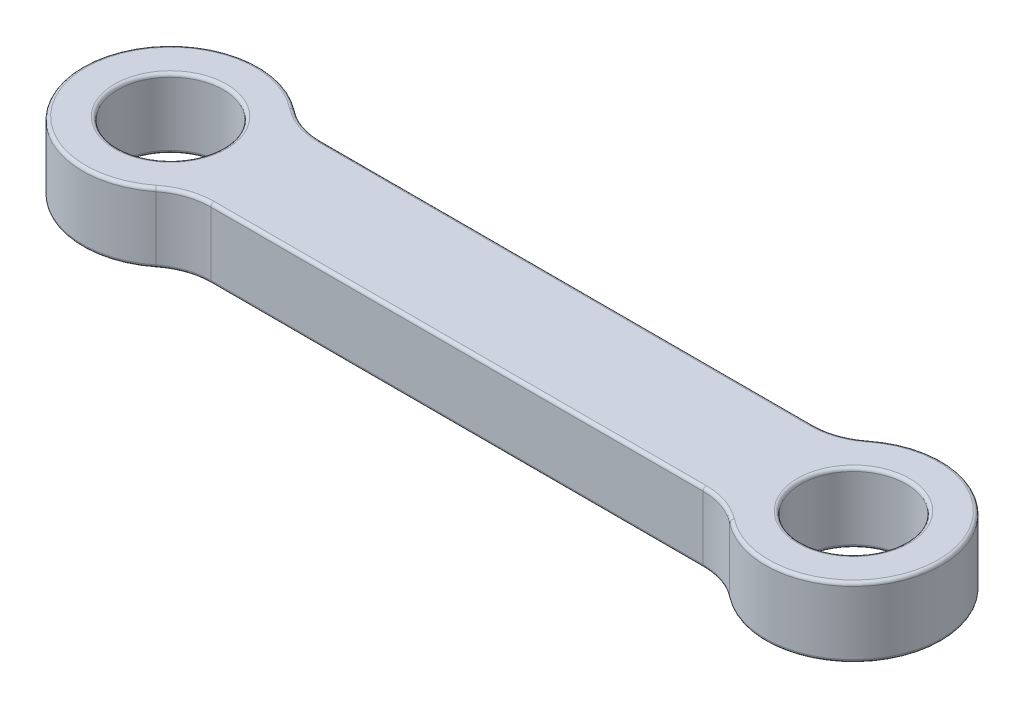
ISO-10303-21;
HEADER;
FILE_DESCRIPTION(('STEP AP214'),'2;1');
FILE_NAME('part.step','',(''),(''),'','','');
FILE_SCHEMA(('AUTOMOTIVE_DESIGN { 1 0 10303 214 1 1 1 1 }'));
ENDSEC;
DATA;
#1=APPLICATION_CONTEXT('core data for automotive mechanical design processes');
#2=APPLICATION_PROTOCOL_DEFINITION('international standard','automotive_design',2000,#1);
#3=PRODUCT_CONTEXT('',#1,'mechanical');
#4=PRODUCT('Part','Part','',(#3));
#5=PRODUCT_RELATED_PRODUCT_CATEGORY('part','',(#4));
#6=PRODUCT_DEFINITION_FORMATION('','',#4);
#7=PRODUCT_DEFINITION_CONTEXT('part definition',#1,'design');
#8=PRODUCT_DEFINITION('design','',#6,#7);
#9=PRODUCT_DEFINITION_SHAPE('','',#8);
#10=(LENGTH_UNIT() NAMED_UNIT(*) SI_UNIT(.MILLI.,.METRE.));
#11=(NAMED_UNIT(*) PLANE_ANGLE_UNIT() SI_UNIT($,.RADIAN.));
#12=(NAMED_UNIT(*) SI_UNIT($,.STERADIAN.) SOLID_ANGLE_UNIT());
#13=UNCERTAINTY_MEASURE_WITH_UNIT(LENGTH_MEASURE(1.E-05),#10,'distance_accuracy_value','');
#14=(GEOMETRIC_REPRESENTATION_CONTEXT(3) GLOBAL_UNCERTAINTY_ASSIGNED_CONTEXT((#13)) GLOBAL_UNIT_ASSIGNED_CONTEXT((#10,
#11,#12)) REPRESENTATION_CONTEXT('',''));
#15=CARTESIAN_POINT('',(0.,0.,0.));
#16=DIRECTION('',(0.,0.,1.));
#17=DIRECTION('',(1.,0.,0.));
#18=AXIS2_PLACEMENT_3D('',#15,#16,#17);
#19=CARTESIAN_POINT('',(-15.5,3.175,0.));
#20=DIRECTION('',(0.,-1.,0.));
#21=DIRECTION('',(0.,0.,-1.));
#22=AXIS2_PLACEMENT_3D('',#19,#20,#21);
#23=CYLINDRICAL_SURFACE('',#22,4.);
#24=DIRECTION('',(0.,-1.,0.));
#25=VECTOR('',#24,1.);
#26=CARTESIAN_POINT('',(-13.025641703473,3.175,-3.14285714285715));
#27=LINE('',#26,#25);
#28=CARTESIAN_POINT('',(-13.025641703473,3.025,-3.14285714285715));
#29=VERTEX_POINT('',#28);
#30=CARTESIAN_POINT('',(-13.025641703473,0.15,-3.14285714285715));
#31=VERTEX_POINT('',#30);
#32=EDGE_CURVE('E368',#29,#31,#27,.T.);
#33=ORIENTED_EDGE('',*,*,#32,.T.);
#34=CARTESIAN_POINT('',(-15.5,0.15,0.));
#35=DIRECTION('',(0.,1.,0.));
#36=DIRECTION('',(0.,0.,1.));
#37=AXIS2_PLACEMENT_3D('',#34,#35,#36);
#38=CIRCLE('',#37,4.);
#39=CARTESIAN_POINT('',(-13.025641703473,0.15,3.14285714285714));
#40=VERTEX_POINT('',#39);
#41=EDGE_CURVE('E256',#31,#40,#38,.T.);
#42=ORIENTED_EDGE('',*,*,#41,.T.);
#43=DIRECTION('',(0.,-1.,0.));
#44=VECTOR('',#43,1.);
#45=CARTESIAN_POINT('',(-13.025641703473,3.175,3.14285714285714));
#46=LINE('',#45,#44);
#47=CARTESIAN_POINT('',(-13.025641703473,3.025,3.14285714285714));
#48=VERTEX_POINT('',#47);
#49=EDGE_CURVE('E316',#40,#48,#46,.F.);
#50=ORIENTED_EDGE('',*,*,#49,.T.);
#51=CARTESIAN_POINT('',(-15.5,3.025,0.));
#52=DIRECTION('',(0.,1.,0.));
#53=DIRECTION('',(0.,0.,1.));
#54=AXIS2_PLACEMENT_3D('',#51,#52,#53);
#55=CIRCLE('',#54,4.);
#56=EDGE_CURVE('E253',#48,#29,#55,.F.);
#57=ORIENTED_EDGE('',*,*,#56,.T.);
#58=EDGE_LOOP('',(#33,#42,#50,#57));
#59=FACE_BOUND('',#58,.T.);
#60=ADVANCED_FACE('F47',(#59),#23,.T.);
#61=CARTESIAN_POINT('',(0.,3.175,2.5));
#62=DIRECTION('',(0.,0.,-1.));
#63=DIRECTION('',(-1.,0.,0.));
#64=AXIS2_PLACEMENT_3D('',#61,#62,#63);
#65=PLANE('',#64);
#66=DIRECTION('',(0.,1.,0.));
#67=VECTOR('',#66,1.);
#68=CARTESIAN_POINT('',(-11.1698729810778,0.,2.5));
#69=LINE('',#68,#67);
#70=CARTESIAN_POINT('',(-11.1698729810778,3.025,2.5));
#71=VERTEX_POINT('',#70);
#72=CARTESIAN_POINT('',(-11.1698729810778,0.15,2.5));
#73=VERTEX_POINT('',#72);
#74=EDGE_CURVE('E363',#71,#73,#69,.F.);
#75=ORIENTED_EDGE('',*,*,#74,.T.);
#76=DIRECTION('',(1.,0.,0.));
#77=VECTOR('',#76,1.);
#78=CARTESIAN_POINT('',(0.,0.15,2.5));
#79=LINE('',#78,#77);
#80=CARTESIAN_POINT('',(11.1698729810778,0.15,2.5));
#81=VERTEX_POINT('',#80);
#82=EDGE_CURVE('E219',#73,#81,#79,.T.);
#83=ORIENTED_EDGE('',*,*,#82,.T.);
#84=DIRECTION('',(0.,1.,0.));
#85=VECTOR('',#84,1.);
#86=CARTESIAN_POINT('',(11.1698729810778,3.175,2.5));
#87=LINE('',#86,#85);
#88=CARTESIAN_POINT('',(11.1698729810778,3.025,2.5));
#89=VERTEX_POINT('',#88);
#90=EDGE_CURVE('E391',#81,#89,#87,.T.);
#91=ORIENTED_EDGE('',*,*,#90,.T.);
#92=DIRECTION('',(1.,0.,0.));
#93=VECTOR('',#92,1.);
#94=CARTESIAN_POINT('',(-11.1698729810778,3.025,2.5));
#95=LINE('',#94,#93);
#96=EDGE_CURVE('E216',#89,#71,#95,.F.);
#97=ORIENTED_EDGE('',*,*,#96,.T.);
#98=EDGE_LOOP('',(#75,#83,#91,#97));
#99=FACE_BOUND('',#98,.T.);
#100=ADVANCED_FACE('F421',(#99),#65,.F.);
#101=CARTESIAN_POINT('',(15.5,3.175,0.));
#102=DIRECTION('',(0.,-1.,0.));
#103=DIRECTION('',(0.,0.,-1.));
#104=AXIS2_PLACEMENT_3D('',#101,#102,#103);
#105=CYLINDRICAL_SURFACE('',#104,3.99999999999999);
#106=DIRECTION('',(0.,-1.,0.));
#107=VECTOR('',#106,1.);
#108=CARTESIAN_POINT('',(13.025641703473,3.175,3.14285714285714));
#109=LINE('',#108,#107);
#110=CARTESIAN_POINT('',(13.025641703473,3.025,3.14285714285714));
#111=VERTEX_POINT('',#110);
#112=CARTESIAN_POINT('',(13.025641703473,0.15,3.14285714285714));
#113=VERTEX_POINT('',#112);
#114=EDGE_CURVE('E381',#111,#113,#109,.T.);
#115=ORIENTED_EDGE('',*,*,#114,.T.);
#116=CARTESIAN_POINT('',(15.5,0.15,0.));
#117=DIRECTION('',(0.,1.,0.));
#118=DIRECTION('',(0.,0.,1.));
#119=AXIS2_PLACEMENT_3D('',#116,#117,#118);
#120=CIRCLE('',#119,3.99999999999999);
#121=CARTESIAN_POINT('',(13.025641703473,0.15,-3.14285714285714));
#122=VERTEX_POINT('',#121);
#123=EDGE_CURVE('E231',#113,#122,#120,.T.);
#124=ORIENTED_EDGE('',*,*,#123,.T.);
#125=DIRECTION('',(0.,-1.,0.));
#126=VECTOR('',#125,1.);
#127=CARTESIAN_POINT('',(13.025641703473,3.175,-3.14285714285714));
#128=LINE('',#127,#126);
#129=CARTESIAN_POINT('',(13.025641703473,3.025,-3.14285714285714));
#130=VERTEX_POINT('',#129);
#131=EDGE_CURVE('E385',#122,#130,#128,.F.);
#132=ORIENTED_EDGE('',*,*,#131,.T.);
#133=CARTESIAN_POINT('',(15.5,3.025,0.));
#134=DIRECTION('',(0.,1.,0.));
#135=DIRECTION('',(0.,0.,1.));
#136=AXIS2_PLACEMENT_3D('',#133,#134,#135);
#137=CIRCLE('',#136,3.99999999999999);
#138=EDGE_CURVE('E228',#130,#111,#137,.F.);
#139=ORIENTED_EDGE('',*,*,#138,.T.);
#140=EDGE_LOOP('',(#115,#124,#132,#139));
#141=FACE_BOUND('',#140,.T.);
#142=ADVANCED_FACE('F466',(#141),#105,.T.);
#143=CARTESIAN_POINT('',(0.,3.175,-2.5));
#144=DIRECTION('',(0.,0.,-1.));
#145=DIRECTION('',(-1.,0.,0.));
#146=AXIS2_PLACEMENT_3D('',#143,#144,#145);
#147=PLANE('',#146);
#148=DIRECTION('',(0.,-1.,0.));
#149=VECTOR('',#148,1.);
#150=CARTESIAN_POINT('',(11.1698729810778,3.175,-2.5));
#151=LINE('',#150,#149);
#152=CARTESIAN_POINT('',(11.1698729810778,3.025,-2.5));
#153=VERTEX_POINT('',#152);
#154=CARTESIAN_POINT('',(11.1698729810778,0.15,-2.5));
#155=VERTEX_POINT('',#154);
#156=EDGE_CURVE('E371',#153,#155,#151,.T.);
#157=ORIENTED_EDGE('',*,*,#156,.T.);
#158=DIRECTION('',(1.,0.,0.));
#159=VECTOR('',#158,1.);
#160=CARTESIAN_POINT('',(-11.1698729810778,0.15,-2.5));
#161=LINE('',#160,#159);
#162=CARTESIAN_POINT('',(-11.1698729810778,0.15,-2.5));
#163=VERTEX_POINT('',#162);
#164=EDGE_CURVE('E244',#155,#163,#161,.F.);
#165=ORIENTED_EDGE('',*,*,#164,.T.);
#166=DIRECTION('',(0.,-1.,0.));
#167=VECTOR('',#166,1.);
#168=CARTESIAN_POINT('',(-11.1698729810778,3.175,-2.5));
#169=LINE('',#168,#167);
#170=CARTESIAN_POINT('',(-11.1698729810778,3.025,-2.5));
#171=VERTEX_POINT('',#170);
#172=EDGE_CURVE('E377',#163,#171,#169,.F.);
#173=ORIENTED_EDGE('',*,*,#172,.T.);
#174=DIRECTION('',(1.,0.,0.));
#175=VECTOR('',#174,1.);
#176=CARTESIAN_POINT('',(0.,3.025,-2.5));
#177=LINE('',#176,#175);
#178=EDGE_CURVE('E241',#171,#153,#177,.T.);
#179=ORIENTED_EDGE('',*,*,#178,.T.);
#180=EDGE_LOOP('',(#157,#165,#173,#179));
#181=FACE_BOUND('',#180,.T.);
#182=ADVANCED_FACE('F450',(#181),#147,.T.);
#183=CARTESIAN_POINT('',(-15.5,3.175,0.));
#184=DIRECTION('',(0.,-1.,0.));
#185=DIRECTION('',(0.,0.,-1.));
#186=AXIS2_PLACEMENT_3D('',#183,#184,#185);
#187=CYLINDRICAL_SURFACE('',#186,2.395);
#188=CARTESIAN_POINT('',(-15.5,0.15,0.));
#189=DIRECTION('',(0.,1.,0.));
#190=DIRECTION('',(0.,0.,1.));
#191=AXIS2_PLACEMENT_3D('',#188,#189,#190);
#192=CIRCLE('',#191,2.395);
#193=CARTESIAN_POINT('',(-15.5,0.15,2.395));
#194=VERTEX_POINT('',#193);
#195=EDGE_CURVE('E263',#194,#194,#192,.F.);
#196=ORIENTED_EDGE('',*,*,#195,.T.);
#197=EDGE_LOOP('',(#196));
#198=FACE_BOUND('',#197,.T.);
#199=CARTESIAN_POINT('',(-15.5,3.025,0.));
#200=DIRECTION('',(0.,1.,0.));
#201=DIRECTION('',(0.,0.,1.));
#202=AXIS2_PLACEMENT_3D('',#199,#200,#201);
#203=CIRCLE('',#202,2.395);
#204=CARTESIAN_POINT('',(-15.5,3.025,2.395));
#205=VERTEX_POINT('',#204);
#206=EDGE_CURVE('E259',#205,#205,#203,.T.);
#207=ORIENTED_EDGE('',*,*,#206,.T.);
#208=EDGE_LOOP('',(#207));
#209=FACE_BOUND('',#208,.T.);
#210=ADVANCED_FACE('F473',(#198,#209),#187,.F.);
#211=CARTESIAN_POINT('',(15.5,3.175,0.));
#212=DIRECTION('',(0.,-1.,0.));
#213=DIRECTION('',(0.,0.,-1.));
#214=AXIS2_PLACEMENT_3D('',#211,#212,#213);
#215=CYLINDRICAL_SURFACE('',#214,2.395);
#216=CARTESIAN_POINT('',(15.5,0.15,0.));
#217=DIRECTION('',(0.,1.,0.));
#218=DIRECTION('',(0.,0.,1.));
#219=AXIS2_PLACEMENT_3D('',#216,#217,#218);
#220=CIRCLE('',#219,2.395);
#221=CARTESIAN_POINT('',(15.5,0.15,2.39500000000001));
#222=VERTEX_POINT('',#221);
#223=EDGE_CURVE('E207',#222,#222,#220,.F.);
#224=ORIENTED_EDGE('',*,*,#223,.T.);
#225=EDGE_LOOP('',(#224));
#226=FACE_BOUND('',#225,.T.);
#227=CARTESIAN_POINT('',(15.5,3.025,0.));
#228=DIRECTION('',(0.,1.,0.));
#229=DIRECTION('',(0.,0.,1.));
#230=AXIS2_PLACEMENT_3D('',#227,#228,#229);
#231=CIRCLE('',#230,2.395);
#232=CARTESIAN_POINT('',(15.5,3.025,2.39500000000001));
#233=VERTEX_POINT('',#232);
#234=EDGE_CURVE('E198',#233,#233,#231,.T.);
#235=ORIENTED_EDGE('',*,*,#234,.T.);
#236=EDGE_LOOP('',(#235));
#237=FACE_BOUND('',#236,.T.);
#238=ADVANCED_FACE('F483',(#226,#237),#215,.F.);
#239=CARTESIAN_POINT('',(0.,3.175,0.));
#240=DIRECTION('',(0.,1.,0.));
#241=DIRECTION('',(0.,0.,1.));
#242=AXIS2_PLACEMENT_3D('',#239,#240,#241);
#243=PLANE('',#242);
#244=CARTESIAN_POINT('',(15.5,3.175,0.));
#245=DIRECTION('',(0.,1.,0.));
#246=DIRECTION('',(0.,0.,1.));
#247=AXIS2_PLACEMENT_3D('',#244,#245,#246);
#248=CIRCLE('',#247,2.545);
#249=CARTESIAN_POINT('',(15.5,3.175,2.54500000000001));
#250=VERTEX_POINT('',#249);
#251=EDGE_CURVE('E11',#250,#250,#248,.F.);
#252=ORIENTED_EDGE('',*,*,#251,.T.);
#253=EDGE_LOOP('',(#252));
#254=FACE_BOUND('',#253,.T.);
#255=CARTESIAN_POINT('',(15.5,3.175,0.));
#256=DIRECTION('',(0.,1.,0.));
#257=DIRECTION('',(0.,0.,1.));
#258=AXIS2_PLACEMENT_3D('',#255,#256,#257);
#259=CIRCLE('',#258,3.84999999999999);
#260=CARTESIAN_POINT('',(13.1184301395928,3.175,3.025));
#261=VERTEX_POINT('',#260);
#262=CARTESIAN_POINT('',(13.1184301395928,3.175,-3.025));
#263=VERTEX_POINT('',#262);
#264=EDGE_CURVE('E65',#261,#263,#259,.T.);
#265=ORIENTED_EDGE('',*,*,#264,.T.);
#266=CARTESIAN_POINT('',(11.1698729810778,3.175,-5.5));
#267=DIRECTION('',(0.,1.,0.));
#268=DIRECTION('',(0.,0.,1.));
#269=AXIS2_PLACEMENT_3D('',#266,#267,#268);
#270=CIRCLE('',#269,3.15);
#271=CARTESIAN_POINT('',(11.1698729810778,3.175,-2.35));
#272=VERTEX_POINT('',#271);
#273=EDGE_CURVE('E57',#263,#272,#270,.F.);
#274=ORIENTED_EDGE('',*,*,#273,.T.);
#275=DIRECTION('',(1.,0.,0.));
#276=VECTOR('',#275,1.);
#277=CARTESIAN_POINT('',(0.,3.175,-2.35));
#278=LINE('',#277,#276);
#279=CARTESIAN_POINT('',(-11.1698729810778,3.175,-2.35));
#280=VERTEX_POINT('',#279);
#281=EDGE_CURVE('E271',#272,#280,#278,.F.);
#282=ORIENTED_EDGE('',*,*,#281,.T.);
#283=CARTESIAN_POINT('',(-11.1698729810778,3.175,-5.5));
#284=DIRECTION('',(0.,1.,0.));
#285=DIRECTION('',(0.,0.,1.));
#286=AXIS2_PLACEMENT_3D('',#283,#284,#285);
#287=CIRCLE('',#286,3.15);
#288=CARTESIAN_POINT('',(-13.1184301395928,3.175,-3.025));
#289=VERTEX_POINT('',#288);
#290=EDGE_CURVE('E274',#280,#289,#287,.F.);
#291=ORIENTED_EDGE('',*,*,#290,.T.);
#292=CARTESIAN_POINT('',(-15.5,3.175,0.));
#293=DIRECTION('',(0.,1.,0.));
#294=DIRECTION('',(0.,0.,1.));
#295=AXIS2_PLACEMENT_3D('',#292,#293,#294);
#296=CIRCLE('',#295,3.85);
#297=CARTESIAN_POINT('',(-13.1184301395928,3.175,3.025));
#298=VERTEX_POINT('',#297);
#299=EDGE_CURVE('E277',#289,#298,#296,.T.);
#300=ORIENTED_EDGE('',*,*,#299,.T.);
#301=CARTESIAN_POINT('',(-11.1698729810778,3.175,5.5));
#302=DIRECTION('',(0.,1.,0.));
#303=DIRECTION('',(0.,0.,1.));
#304=AXIS2_PLACEMENT_3D('',#301,#302,#303);
#305=CIRCLE('',#304,3.15);
#306=CARTESIAN_POINT('',(-11.1698729810778,3.175,2.35));
#307=VERTEX_POINT('',#306);
#308=EDGE_CURVE('E280',#298,#307,#305,.F.);
#309=ORIENTED_EDGE('',*,*,#308,.T.);
#310=DIRECTION('',(1.,0.,0.));
#311=VECTOR('',#310,1.);
#312=CARTESIAN_POINT('',(11.1698729810778,3.175,2.35));
#313=LINE('',#312,#311);
#314=CARTESIAN_POINT('',(11.1698729810778,3.175,2.35));
#315=VERTEX_POINT('',#314);
#316=EDGE_CURVE('E283',#307,#315,#313,.T.);
#317=ORIENTED_EDGE('',*,*,#316,.T.);
#318=CARTESIAN_POINT('',(11.1698729810778,3.175,5.5));
#319=DIRECTION('',(0.,1.,0.));
#320=DIRECTION('',(0.,0.,1.));
#321=AXIS2_PLACEMENT_3D('',#318,#319,#320);
#322=CIRCLE('',#321,3.15);
#323=EDGE_CURVE('E70',#315,#261,#322,.F.);
#324=ORIENTED_EDGE('',*,*,#323,.T.);
#325=EDGE_LOOP('',(#265,#274,#282,#291,#300,#309,#317,#324));
#326=FACE_BOUND('',#325,.T.);
#327=CARTESIAN_POINT('',(-15.5,3.175,0.));
#328=DIRECTION('',(0.,1.,0.));
#329=DIRECTION('',(0.,0.,1.));
#330=AXIS2_PLACEMENT_3D('',#327,#328,#329);
#331=CIRCLE('',#330,2.545);
#332=CARTESIAN_POINT('',(-15.5,3.175,2.545));
#333=VERTEX_POINT('',#332);
#334=EDGE_CURVE('E267',#333,#333,#331,.F.);
#335=ORIENTED_EDGE('',*,*,#334,.T.);
#336=EDGE_LOOP('',(#335));
#337=FACE_BOUND('',#336,.T.);
#338=ADVANCED_FACE('F437',(#254,#326,#337),#243,.T.);
#339=CARTESIAN_POINT('',(0.,0.,0.));
#340=DIRECTION('',(0.,1.,0.));
#341=DIRECTION('',(0.,0.,1.));
#342=AXIS2_PLACEMENT_3D('',#339,#340,#341);
#343=PLANE('',#342);
#344=CARTESIAN_POINT('',(15.5,0.,0.));
#345=DIRECTION('',(0.,1.,0.));
#346=DIRECTION('',(0.,0.,1.));
#347=AXIS2_PLACEMENT_3D('',#344,#345,#346);
#348=CIRCLE('',#347,2.545);
#349=CARTESIAN_POINT('',(15.5,0.,2.54500000000001));
#350=VERTEX_POINT('',#349);
#351=EDGE_CURVE('E193',#350,#350,#348,.T.);
#352=ORIENTED_EDGE('',*,*,#351,.T.);
#353=EDGE_LOOP('',(#352));
#354=FACE_BOUND('',#353,.T.);
#355=DIRECTION('',(1.,0.,0.));
#356=VECTOR('',#355,1.);
#357=CARTESIAN_POINT('',(0.,0.,2.35));
#358=LINE('',#357,#356);
#359=CARTESIAN_POINT('',(11.1698729810778,0.,2.35));
#360=VERTEX_POINT('',#359);
#361=CARTESIAN_POINT('',(-11.1698729810778,0.,2.35));
#362=VERTEX_POINT('',#361);
#363=EDGE_CURVE('E190',#360,#362,#358,.F.);
#364=ORIENTED_EDGE('',*,*,#363,.T.);
#365=CARTESIAN_POINT('',(-11.1698729810778,0.,5.5));
#366=DIRECTION('',(0.,1.,0.));
#367=DIRECTION('',(0.,0.,1.));
#368=AXIS2_PLACEMENT_3D('',#365,#366,#367);
#369=CIRCLE('',#368,3.15);
#370=CARTESIAN_POINT('',(-13.1184301395928,0.,3.025));
#371=VERTEX_POINT('',#370);
#372=EDGE_CURVE('E168',#362,#371,#369,.T.);
#373=ORIENTED_EDGE('',*,*,#372,.T.);
#374=CARTESIAN_POINT('',(-15.5,0.,0.));
#375=DIRECTION('',(0.,1.,0.));
#376=DIRECTION('',(0.,0.,1.));
#377=AXIS2_PLACEMENT_3D('',#374,#375,#376);
#378=CIRCLE('',#377,3.85);
#379=CARTESIAN_POINT('',(-13.1184301395928,0.,-3.025));
#380=VERTEX_POINT('',#379);
#381=EDGE_CURVE('E177',#371,#380,#378,.F.);
#382=ORIENTED_EDGE('',*,*,#381,.T.);
#383=CARTESIAN_POINT('',(-11.1698729810778,0.,-5.5));
#384=DIRECTION('',(0.,1.,0.));
#385=DIRECTION('',(0.,0.,1.));
#386=AXIS2_PLACEMENT_3D('',#383,#384,#385);
#387=CIRCLE('',#386,3.15);
#388=CARTESIAN_POINT('',(-11.1698729810778,0.,-2.35));
#389=VERTEX_POINT('',#388);
#390=EDGE_CURVE('E184',#380,#389,#387,.T.);
#391=ORIENTED_EDGE('',*,*,#390,.T.);
#392=DIRECTION('',(1.,0.,0.));
#393=VECTOR('',#392,1.);
#394=CARTESIAN_POINT('',(11.1698729810778,0.,-2.35));
#395=LINE('',#394,#393);
#396=CARTESIAN_POINT('',(11.1698729810778,0.,-2.35));
#397=VERTEX_POINT('',#396);
#398=EDGE_CURVE('E400',#389,#397,#395,.T.);
#399=ORIENTED_EDGE('',*,*,#398,.T.);
#400=CARTESIAN_POINT('',(11.1698729810778,0.,-5.5));
#401=DIRECTION('',(0.,1.,0.));
#402=DIRECTION('',(0.,0.,1.));
#403=AXIS2_PLACEMENT_3D('',#400,#401,#402);
#404=CIRCLE('',#403,3.15);
#405=CARTESIAN_POINT('',(13.1184301395928,0.,-3.025));
#406=VERTEX_POINT('',#405);
#407=EDGE_CURVE('E403',#397,#406,#404,.T.);
#408=ORIENTED_EDGE('',*,*,#407,.T.);
#409=CARTESIAN_POINT('',(15.5,0.,0.));
#410=DIRECTION('',(0.,1.,0.));
#411=DIRECTION('',(0.,0.,1.));
#412=AXIS2_PLACEMENT_3D('',#409,#410,#411);
#413=CIRCLE('',#412,3.84999999999999);
#414=CARTESIAN_POINT('',(13.1184301395928,0.,3.025));
#415=VERTEX_POINT('',#414);
#416=EDGE_CURVE('E406',#406,#415,#413,.F.);
#417=ORIENTED_EDGE('',*,*,#416,.T.);
#418=CARTESIAN_POINT('',(11.1698729810778,0.,5.5));
#419=DIRECTION('',(0.,1.,0.));
#420=DIRECTION('',(0.,0.,1.));
#421=AXIS2_PLACEMENT_3D('',#418,#419,#420);
#422=CIRCLE('',#421,3.15);
#423=EDGE_CURVE('E200',#415,#360,#422,.T.);
#424=ORIENTED_EDGE('',*,*,#423,.T.);
#425=EDGE_LOOP('',(#364,#373,#382,#391,#399,#408,#417,#424));
#426=FACE_BOUND('',#425,.T.);
#427=CARTESIAN_POINT('',(-15.5,0.,0.));
#428=DIRECTION('',(0.,1.,0.));
#429=DIRECTION('',(0.,0.,1.));
#430=AXIS2_PLACEMENT_3D('',#427,#428,#429);
#431=CIRCLE('',#430,2.545);
#432=CARTESIAN_POINT('',(-15.5,0.,2.545));
#433=VERTEX_POINT('',#432);
#434=EDGE_CURVE('E185',#433,#433,#431,.T.);
#435=ORIENTED_EDGE('',*,*,#434,.T.);
#436=EDGE_LOOP('',(#435));
#437=FACE_BOUND('',#436,.T.);
#438=ADVANCED_FACE('F187',(#354,#426,#437),#343,.F.);
#439=CARTESIAN_POINT('',(-11.1698729810778,3.175,-5.5));
#440=DIRECTION('',(0.,-1.,0.));
#441=DIRECTION('',(0.,0.,-1.));
#442=AXIS2_PLACEMENT_3D('',#439,#440,#441);
#443=CYLINDRICAL_SURFACE('',#442,3.);
#444=ORIENTED_EDGE('',*,*,#172,.F.);
#445=CARTESIAN_POINT('',(-11.1698729810778,0.15,-5.5));
#446=DIRECTION('',(0.,1.,0.));
#447=DIRECTION('',(0.,0.,1.));
#448=AXIS2_PLACEMENT_3D('',#445,#446,#447);
#449=CIRCLE('',#448,3.);
#450=EDGE_CURVE('E250',#163,#31,#449,.F.);
#451=ORIENTED_EDGE('',*,*,#450,.T.);
#452=ORIENTED_EDGE('',*,*,#32,.F.);
#453=CARTESIAN_POINT('',(-11.1698729810778,3.025,-5.5));
#454=DIRECTION('',(0.,1.,0.));
#455=DIRECTION('',(0.,0.,1.));
#456=AXIS2_PLACEMENT_3D('',#453,#454,#455);
#457=CIRCLE('',#456,3.);
#458=EDGE_CURVE('E247',#29,#171,#457,.T.);
#459=ORIENTED_EDGE('',*,*,#458,.T.);
#460=EDGE_LOOP('',(#444,#451,#452,#459));
#461=FACE_BOUND('',#460,.T.);
#462=ADVANCED_FACE('F485',(#461),#443,.F.);
#463=CARTESIAN_POINT('',(11.1698729810778,3.175,-5.5));
#464=DIRECTION('',(0.,-1.,0.));
#465=DIRECTION('',(0.,0.,-1.));
#466=AXIS2_PLACEMENT_3D('',#463,#464,#465);
#467=CYLINDRICAL_SURFACE('',#466,3.);
#468=ORIENTED_EDGE('',*,*,#131,.F.);
#469=CARTESIAN_POINT('',(11.1698729810778,0.15,-5.5));
#470=DIRECTION('',(0.,1.,0.));
#471=DIRECTION('',(0.,0.,1.));
#472=AXIS2_PLACEMENT_3D('',#469,#470,#471);
#473=CIRCLE('',#472,3.);
#474=EDGE_CURVE('E238',#122,#155,#473,.F.);
#475=ORIENTED_EDGE('',*,*,#474,.T.);
#476=ORIENTED_EDGE('',*,*,#156,.F.);
#477=CARTESIAN_POINT('',(11.1698729810778,3.025,-5.5));
#478=DIRECTION('',(0.,1.,0.));
#479=DIRECTION('',(0.,0.,1.));
#480=AXIS2_PLACEMENT_3D('',#477,#478,#479);
#481=CIRCLE('',#480,3.);
#482=EDGE_CURVE('E234',#153,#130,#481,.T.);
#483=ORIENTED_EDGE('',*,*,#482,.T.);
#484=EDGE_LOOP('',(#468,#475,#476,#483));
#485=FACE_BOUND('',#484,.T.);
#486=ADVANCED_FACE('F455',(#485),#467,.F.);
#487=CARTESIAN_POINT('',(11.1698729810778,3.175,5.5));
#488=DIRECTION('',(0.,-1.,0.));
#489=DIRECTION('',(0.,0.,-1.));
#490=AXIS2_PLACEMENT_3D('',#487,#488,#489);
#491=CYLINDRICAL_SURFACE('',#490,3.);
#492=ORIENTED_EDGE('',*,*,#90,.F.);
#493=CARTESIAN_POINT('',(11.1698729810778,0.15,5.5));
#494=DIRECTION('',(0.,1.,0.));
#495=DIRECTION('',(0.,0.,1.));
#496=AXIS2_PLACEMENT_3D('',#493,#494,#495);
#497=CIRCLE('',#496,3.);
#498=EDGE_CURVE('E225',#81,#113,#497,.F.);
#499=ORIENTED_EDGE('',*,*,#498,.T.);
#500=ORIENTED_EDGE('',*,*,#114,.F.);
#501=CARTESIAN_POINT('',(11.1698729810778,3.025,5.5));
#502=DIRECTION('',(0.,1.,0.));
#503=DIRECTION('',(0.,0.,1.));
#504=AXIS2_PLACEMENT_3D('',#501,#502,#503);
#505=CIRCLE('',#504,3.);
#506=EDGE_CURVE('E222',#111,#89,#505,.T.);
#507=ORIENTED_EDGE('',*,*,#506,.T.);
#508=EDGE_LOOP('',(#492,#499,#500,#507));
#509=FACE_BOUND('',#508,.T.);
#510=ADVANCED_FACE('F423',(#509),#491,.F.);
#511=CARTESIAN_POINT('',(-11.1698729810778,3.175,5.5));
#512=DIRECTION('',(0.,-1.,0.));
#513=DIRECTION('',(0.,0.,-1.));
#514=AXIS2_PLACEMENT_3D('',#511,#512,#513);
#515=CYLINDRICAL_SURFACE('',#514,3.);
#516=ORIENTED_EDGE('',*,*,#49,.F.);
#517=CARTESIAN_POINT('',(-11.1698729810778,0.15,5.5));
#518=DIRECTION('',(0.,1.,0.));
#519=DIRECTION('',(0.,0.,1.));
#520=AXIS2_PLACEMENT_3D('',#517,#518,#519);
#521=CIRCLE('',#520,3.);
#522=EDGE_CURVE('E170',#40,#73,#521,.F.);
#523=ORIENTED_EDGE('',*,*,#522,.T.);
#524=ORIENTED_EDGE('',*,*,#74,.F.);
#525=CARTESIAN_POINT('',(-11.1698729810778,3.025,5.5));
#526=DIRECTION('',(0.,1.,0.));
#527=DIRECTION('',(0.,0.,1.));
#528=AXIS2_PLACEMENT_3D('',#525,#526,#527);
#529=CIRCLE('',#528,3.);
#530=EDGE_CURVE('E211',#71,#48,#529,.T.);
#531=ORIENTED_EDGE('',*,*,#530,.T.);
#532=EDGE_LOOP('',(#516,#523,#524,#531));
#533=FACE_BOUND('',#532,.T.);
#534=ADVANCED_FACE('F361',(#533),#515,.F.);
#535=CARTESIAN_POINT('',(15.5,0.15,0.));
#536=DIRECTION('',(0.,1.,0.));
#537=DIRECTION('',(0.,0.,1.));
#538=AXIS2_PLACEMENT_3D('',#535,#536,#537);
#539=TOROIDAL_SURFACE('',#538,2.545,0.15);
#540=ORIENTED_EDGE('',*,*,#223,.F.);
#541=EDGE_LOOP('',(#540));
#542=FACE_BOUND('',#541,.T.);
#543=ORIENTED_EDGE('',*,*,#351,.F.);
#544=EDGE_LOOP('',(#543));
#545=FACE_BOUND('',#544,.T.);
#546=ADVANCED_FACE('F495',(#542,#545),#539,.T.);
#547=CARTESIAN_POINT('',(11.1698729810778,0.15,-5.5));
#548=DIRECTION('',(0.,1.,0.));
#549=DIRECTION('',(0.,0.,1.));
#550=AXIS2_PLACEMENT_3D('',#547,#548,#549);
#551=TOROIDAL_SURFACE('',#550,3.15,0.15);
#552=CARTESIAN_POINT('',(11.1698729810778,0.15,-2.35));
#553=DIRECTION('',(-1.,0.,0.));
#554=DIRECTION('',(0.,0.,1.));
#555=AXIS2_PLACEMENT_3D('',#552,#553,#554);
#556=CIRCLE('',#555,0.15);
#557=EDGE_CURVE('E308',#155,#397,#556,.T.);
#558=ORIENTED_EDGE('',*,*,#557,.F.);
#559=ORIENTED_EDGE('',*,*,#474,.F.);
#560=CARTESIAN_POINT('',(13.1184301395928,0.15,-3.025));
#561=DIRECTION('',(0.785714285714285,0.,-0.618589574131743));
#562=DIRECTION('',(-0.618589574131743,0.,-0.785714285714285));
#563=AXIS2_PLACEMENT_3D('',#560,#561,#562);
#564=CIRCLE('',#563,0.15);
#565=EDGE_CURVE('E312',#406,#122,#564,.T.);
#566=ORIENTED_EDGE('',*,*,#565,.F.);
#567=ORIENTED_EDGE('',*,*,#407,.F.);
#568=EDGE_LOOP('',(#558,#559,#566,#567));
#569=FACE_BOUND('',#568,.T.);
#570=ADVANCED_FACE('F459',(#569),#551,.T.);
#571=CARTESIAN_POINT('',(15.5,0.15,0.));
#572=DIRECTION('',(0.,1.,0.));
#573=DIRECTION('',(0.,0.,1.));
#574=AXIS2_PLACEMENT_3D('',#571,#572,#573);
#575=TOROIDAL_SURFACE('',#574,3.84999999999999,0.15);
#576=ORIENTED_EDGE('',*,*,#565,.T.);
#577=ORIENTED_EDGE('',*,*,#123,.F.);
#578=CARTESIAN_POINT('',(13.1184301395928,0.15,3.025));
#579=DIRECTION('',(-0.785714285714283,0.,-0.618589574131746));
#580=DIRECTION('',(-0.618589574131746,0.,0.785714285714283));
#581=AXIS2_PLACEMENT_3D('',#578,#579,#580);
#582=CIRCLE('',#581,0.15);
#583=EDGE_CURVE('E304',#415,#113,#582,.T.);
#584=ORIENTED_EDGE('',*,*,#583,.F.);
#585=ORIENTED_EDGE('',*,*,#416,.F.);
#586=EDGE_LOOP('',(#576,#577,#584,#585));
#587=FACE_BOUND('',#586,.T.);
#588=ADVANCED_FACE('F464',(#587),#575,.T.);
#589=CARTESIAN_POINT('',(0.,0.15,-2.35));
#590=DIRECTION('',(-1.,0.,0.));
#591=DIRECTION('',(0.,0.,1.));
#592=AXIS2_PLACEMENT_3D('',#589,#590,#591);
#593=CYLINDRICAL_SURFACE('',#592,0.15);
#594=ORIENTED_EDGE('',*,*,#557,.T.);
#595=ORIENTED_EDGE('',*,*,#398,.F.);
#596=CARTESIAN_POINT('',(-11.1698729810778,0.15,-2.35));
#597=DIRECTION('',(-1.,0.,0.));
#598=DIRECTION('',(0.,0.,1.));
#599=AXIS2_PLACEMENT_3D('',#596,#597,#598);
#600=CIRCLE('',#599,0.15);
#601=EDGE_CURVE('E300',#163,#389,#600,.T.);
#602=ORIENTED_EDGE('',*,*,#601,.F.);
#603=ORIENTED_EDGE('',*,*,#164,.F.);
#604=EDGE_LOOP('',(#594,#595,#602,#603));
#605=FACE_BOUND('',#604,.T.);
#606=ADVANCED_FACE('F512',(#605),#593,.T.);
#607=CARTESIAN_POINT('',(11.1698729810778,0.15,5.5));
#608=DIRECTION('',(0.,1.,0.));
#609=DIRECTION('',(0.,0.,1.));
#610=AXIS2_PLACEMENT_3D('',#607,#608,#609);
#611=TOROIDAL_SURFACE('',#610,3.15,0.15);
#612=ORIENTED_EDGE('',*,*,#583,.T.);
#613=ORIENTED_EDGE('',*,*,#498,.F.);
#614=CARTESIAN_POINT('',(11.1698729810778,0.15,2.35));
#615=DIRECTION('',(-1.,0.,0.));
#616=DIRECTION('',(0.,0.,1.));
#617=AXIS2_PLACEMENT_3D('',#614,#615,#616);
#618=CIRCLE('',#617,0.15);
#619=EDGE_CURVE('E296',#360,#81,#618,.T.);
#620=ORIENTED_EDGE('',*,*,#619,.F.);
#621=ORIENTED_EDGE('',*,*,#423,.F.);
#622=EDGE_LOOP('',(#612,#613,#620,#621));
#623=FACE_BOUND('',#622,.T.);
#624=ADVANCED_FACE('F415',(#623),#611,.T.);
#625=CARTESIAN_POINT('',(-11.1698729810778,0.15,-5.5));
#626=DIRECTION('',(0.,1.,0.));
#627=DIRECTION('',(0.,0.,1.));
#628=AXIS2_PLACEMENT_3D('',#625,#626,#627);
#629=TOROIDAL_SURFACE('',#628,3.15,0.15);
#630=ORIENTED_EDGE('',*,*,#601,.T.);
#631=ORIENTED_EDGE('',*,*,#390,.F.);
#632=CARTESIAN_POINT('',(-13.1184301395928,0.15,-3.025));
#633=DIRECTION('',(-0.785714285714284,0.,-0.618589574131744));
#634=DIRECTION('',(-0.618589574131744,0.,0.785714285714284));
#635=AXIS2_PLACEMENT_3D('',#632,#633,#634);
#636=CIRCLE('',#635,0.15);
#637=EDGE_CURVE('E180',#31,#380,#636,.T.);
#638=ORIENTED_EDGE('',*,*,#637,.F.);
#639=ORIENTED_EDGE('',*,*,#450,.F.);
#640=EDGE_LOOP('',(#630,#631,#638,#639));
#641=FACE_BOUND('',#640,.T.);
#642=ADVANCED_FACE('F506',(#641),#629,.T.);
#643=CARTESIAN_POINT('',(0.,0.15,2.35));
#644=DIRECTION('',(1.,0.,0.));
#645=DIRECTION('',(0.,0.,-1.));
#646=AXIS2_PLACEMENT_3D('',#643,#644,#645);
#647=CYLINDRICAL_SURFACE('',#646,0.15);
#648=ORIENTED_EDGE('',*,*,#619,.T.);
#649=ORIENTED_EDGE('',*,*,#82,.F.);
#650=CARTESIAN_POINT('',(-11.1698729810778,0.15,2.35));
#651=DIRECTION('',(-1.,0.,0.));
#652=DIRECTION('',(0.,0.,1.));
#653=AXIS2_PLACEMENT_3D('',#650,#651,#652);
#654=CIRCLE('',#653,0.15);
#655=EDGE_CURVE('E174',#362,#73,#654,.T.);
#656=ORIENTED_EDGE('',*,*,#655,.F.);
#657=ORIENTED_EDGE('',*,*,#363,.F.);
#658=EDGE_LOOP('',(#648,#649,#656,#657));
#659=FACE_BOUND('',#658,.T.);
#660=ADVANCED_FACE('F418',(#659),#647,.T.);
#661=CARTESIAN_POINT('',(-15.5,0.15,0.));
#662=DIRECTION('',(0.,1.,0.));
#663=DIRECTION('',(0.,0.,1.));
#664=AXIS2_PLACEMENT_3D('',#661,#662,#663);
#665=TOROIDAL_SURFACE('',#664,3.85,0.15);
#666=ORIENTED_EDGE('',*,*,#637,.T.);
#667=ORIENTED_EDGE('',*,*,#381,.F.);
#668=CARTESIAN_POINT('',(-13.1184301395928,0.15,3.025));
#669=DIRECTION('',(0.785714285714285,0.,-0.618589574131743));
#670=DIRECTION('',(-0.618589574131743,0.,-0.785714285714285));
#671=AXIS2_PLACEMENT_3D('',#668,#669,#670);
#672=CIRCLE('',#671,0.15);
#673=EDGE_CURVE('E164',#40,#371,#672,.T.);
#674=ORIENTED_EDGE('',*,*,#673,.F.);
#675=ORIENTED_EDGE('',*,*,#41,.F.);
#676=EDGE_LOOP('',(#666,#667,#674,#675));
#677=FACE_BOUND('',#676,.T.);
#678=ADVANCED_FACE('F178',(#677),#665,.T.);
#679=CARTESIAN_POINT('',(-11.1698729810778,0.15,5.5));
#680=DIRECTION('',(0.,1.,0.));
#681=DIRECTION('',(0.,0.,1.));
#682=AXIS2_PLACEMENT_3D('',#679,#680,#681);
#683=TOROIDAL_SURFACE('',#682,3.15,0.15);
#684=ORIENTED_EDGE('',*,*,#655,.T.);
#685=ORIENTED_EDGE('',*,*,#522,.F.);
#686=ORIENTED_EDGE('',*,*,#673,.T.);
#687=ORIENTED_EDGE('',*,*,#372,.F.);
#688=EDGE_LOOP('',(#684,#685,#686,#687));
#689=FACE_BOUND('',#688,.T.);
#690=ADVANCED_FACE('F166',(#689),#683,.T.);
#691=CARTESIAN_POINT('',(-15.5,0.15,0.));
#692=DIRECTION('',(0.,1.,0.));
#693=DIRECTION('',(0.,0.,1.));
#694=AXIS2_PLACEMENT_3D('',#691,#692,#693);
#695=TOROIDAL_SURFACE('',#694,2.545,0.15);
#696=ORIENTED_EDGE('',*,*,#195,.F.);
#697=EDGE_LOOP('',(#696));
#698=FACE_BOUND('',#697,.T.);
#699=ORIENTED_EDGE('',*,*,#434,.F.);
#700=EDGE_LOOP('',(#699));
#701=FACE_BOUND('',#700,.T.);
#702=ADVANCED_FACE('F501',(#698,#701),#695,.T.);
#703=CARTESIAN_POINT('',(15.5,3.025,0.));
#704=DIRECTION('',(0.,1.,0.));
#705=DIRECTION('',(0.,0.,1.));
#706=AXIS2_PLACEMENT_3D('',#703,#704,#705);
#707=TOROIDAL_SURFACE('',#706,2.545,0.15);
#708=ORIENTED_EDGE('',*,*,#251,.F.);
#709=EDGE_LOOP('',(#708));
#710=FACE_BOUND('',#709,.T.);
#711=ORIENTED_EDGE('',*,*,#234,.F.);
#712=EDGE_LOOP('',(#711));
#713=FACE_BOUND('',#712,.T.);
#714=ADVANCED_FACE('F522',(#710,#713),#707,.T.);
#715=CARTESIAN_POINT('',(-11.1698729810778,3.025,5.5));
#716=DIRECTION('',(0.,1.,0.));
#717=DIRECTION('',(0.,0.,1.));
#718=AXIS2_PLACEMENT_3D('',#715,#716,#717);
#719=TOROIDAL_SURFACE('',#718,3.15,0.15);
#720=CARTESIAN_POINT('',(-13.1184301395928,3.025,3.025));
#721=DIRECTION('',(-0.785714285714285,0.,0.618589574131743));
#722=DIRECTION('',(0.618589574131743,0.,0.785714285714285));
#723=AXIS2_PLACEMENT_3D('',#720,#721,#722);
#724=CIRCLE('',#723,0.15);
#725=EDGE_CURVE('E338',#48,#298,#724,.T.);
#726=ORIENTED_EDGE('',*,*,#725,.F.);
#727=ORIENTED_EDGE('',*,*,#530,.F.);
#728=CARTESIAN_POINT('',(-11.1698729810778,3.025,2.35));
#729=DIRECTION('',(1.,0.,0.));
#730=DIRECTION('',(0.,0.,-1.));
#731=AXIS2_PLACEMENT_3D('',#728,#729,#730);
#732=CIRCLE('',#731,0.15);
#733=EDGE_CURVE('E51',#307,#71,#732,.T.);
#734=ORIENTED_EDGE('',*,*,#733,.F.);
#735=ORIENTED_EDGE('',*,*,#308,.F.);
#736=EDGE_LOOP('',(#726,#727,#734,#735));
#737=FACE_BOUND('',#736,.T.);
#738=ADVANCED_FACE('F356',(#737),#719,.T.);
#739=CARTESIAN_POINT('',(0.,3.025,2.35));
#740=DIRECTION('',(-1.,0.,0.));
#741=DIRECTION('',(0.,0.,1.));
#742=AXIS2_PLACEMENT_3D('',#739,#740,#741);
#743=CYLINDRICAL_SURFACE('',#742,0.15);
#744=ORIENTED_EDGE('',*,*,#733,.T.);
#745=ORIENTED_EDGE('',*,*,#96,.F.);
#746=CARTESIAN_POINT('',(11.1698729810778,3.025,2.35));
#747=DIRECTION('',(1.,0.,0.));
#748=DIRECTION('',(0.,0.,-1.));
#749=AXIS2_PLACEMENT_3D('',#746,#747,#748);
#750=CIRCLE('',#749,0.15);
#751=EDGE_CURVE('E335',#315,#89,#750,.T.);
#752=ORIENTED_EDGE('',*,*,#751,.F.);
#753=ORIENTED_EDGE('',*,*,#316,.F.);
#754=EDGE_LOOP('',(#744,#745,#752,#753));
#755=FACE_BOUND('',#754,.T.);
#756=ADVANCED_FACE('F351',(#755),#743,.T.);
#757=CARTESIAN_POINT('',(-15.5,3.025,0.));
#758=DIRECTION('',(0.,1.,0.));
#759=DIRECTION('',(0.,0.,1.));
#760=AXIS2_PLACEMENT_3D('',#757,#758,#759);
#761=TOROIDAL_SURFACE('',#760,3.85,0.15);
#762=ORIENTED_EDGE('',*,*,#725,.T.);
#763=ORIENTED_EDGE('',*,*,#299,.F.);
#764=CARTESIAN_POINT('',(-13.1184301395928,3.025,-3.025));
#765=DIRECTION('',(0.785714285714284,0.,0.618589574131744));
#766=DIRECTION('',(0.618589574131744,0.,-0.785714285714284));
#767=AXIS2_PLACEMENT_3D('',#764,#765,#766);
#768=CIRCLE('',#767,0.15);
#769=EDGE_CURVE('E331',#29,#289,#768,.T.);
#770=ORIENTED_EDGE('',*,*,#769,.F.);
#771=ORIENTED_EDGE('',*,*,#56,.F.);
#772=EDGE_LOOP('',(#762,#763,#770,#771));
#773=FACE_BOUND('',#772,.T.);
#774=ADVANCED_FACE('F537',(#773),#761,.T.);
#775=CARTESIAN_POINT('',(11.1698729810778,3.025,5.5));
#776=DIRECTION('',(0.,1.,0.));
#777=DIRECTION('',(0.,0.,1.));
#778=AXIS2_PLACEMENT_3D('',#775,#776,#777);
#779=TOROIDAL_SURFACE('',#778,3.15,0.15);
#780=ORIENTED_EDGE('',*,*,#751,.T.);
#781=ORIENTED_EDGE('',*,*,#506,.F.);
#782=CARTESIAN_POINT('',(13.1184301395928,3.025,3.025));
#783=DIRECTION('',(0.785714285714285,0.,0.618589574131743));
#784=DIRECTION('',(0.618589574131743,0.,-0.785714285714285));
#785=AXIS2_PLACEMENT_3D('',#782,#783,#784);
#786=CIRCLE('',#785,0.15);
#787=EDGE_CURVE('E327',#261,#111,#786,.T.);
#788=ORIENTED_EDGE('',*,*,#787,.F.);
#789=ORIENTED_EDGE('',*,*,#323,.F.);
#790=EDGE_LOOP('',(#780,#781,#788,#789));
#791=FACE_BOUND('',#790,.T.);
#792=ADVANCED_FACE('F427',(#791),#779,.T.);
#793=CARTESIAN_POINT('',(-11.1698729810778,3.025,-5.5));
#794=DIRECTION('',(0.,1.,0.));
#795=DIRECTION('',(0.,0.,1.));
#796=AXIS2_PLACEMENT_3D('',#793,#794,#795);
#797=TOROIDAL_SURFACE('',#796,3.15,0.15);
#798=ORIENTED_EDGE('',*,*,#769,.T.);
#799=ORIENTED_EDGE('',*,*,#290,.F.);
#800=CARTESIAN_POINT('',(-11.1698729810778,3.025,-2.35));
#801=DIRECTION('',(1.,0.,0.));
#802=DIRECTION('',(0.,0.,-1.));
#803=AXIS2_PLACEMENT_3D('',#800,#801,#802);
#804=CIRCLE('',#803,0.15);
#805=EDGE_CURVE('E323',#171,#280,#804,.T.);
#806=ORIENTED_EDGE('',*,*,#805,.F.);
#807=ORIENTED_EDGE('',*,*,#458,.F.);
#808=EDGE_LOOP('',(#798,#799,#806,#807));
#809=FACE_BOUND('',#808,.T.);
#810=ADVANCED_FACE('F443',(#809),#797,.T.);
#811=CARTESIAN_POINT('',(15.5,3.025,0.));
#812=DIRECTION('',(0.,1.,0.));
#813=DIRECTION('',(0.,0.,1.));
#814=AXIS2_PLACEMENT_3D('',#811,#812,#813);
#815=TOROIDAL_SURFACE('',#814,3.84999999999999,0.15);
#816=ORIENTED_EDGE('',*,*,#787,.T.);
#817=ORIENTED_EDGE('',*,*,#138,.F.);
#818=CARTESIAN_POINT('',(13.1184301395928,3.025,-3.025));
#819=DIRECTION('',(-0.785714285714283,0.,0.618589574131746));
#820=DIRECTION('',(0.618589574131746,0.,0.785714285714283));
#821=AXIS2_PLACEMENT_3D('',#818,#819,#820);
#822=CIRCLE('',#821,0.15);
#823=EDGE_CURVE('E320',#263,#130,#822,.T.);
#824=ORIENTED_EDGE('',*,*,#823,.F.);
#825=ORIENTED_EDGE('',*,*,#264,.F.);
#826=EDGE_LOOP('',(#816,#817,#824,#825));
#827=FACE_BOUND('',#826,.T.);
#828=ADVANCED_FACE('F430',(#827),#815,.T.);
#829=CARTESIAN_POINT('',(0.,3.025,-2.35));
#830=DIRECTION('',(1.,0.,0.));
#831=DIRECTION('',(0.,0.,-1.));
#832=AXIS2_PLACEMENT_3D('',#829,#830,#831);
#833=CYLINDRICAL_SURFACE('',#832,0.15);
#834=ORIENTED_EDGE('',*,*,#805,.T.);
#835=ORIENTED_EDGE('',*,*,#281,.F.);
#836=CARTESIAN_POINT('',(11.1698729810778,3.025,-2.35));
#837=DIRECTION('',(1.,0.,0.));
#838=DIRECTION('',(0.,0.,-1.));
#839=AXIS2_PLACEMENT_3D('',#836,#837,#838);
#840=CIRCLE('',#839,0.15);
#841=EDGE_CURVE('E317',#153,#272,#840,.T.);
#842=ORIENTED_EDGE('',*,*,#841,.F.);
#843=ORIENTED_EDGE('',*,*,#178,.F.);
#844=EDGE_LOOP('',(#834,#835,#842,#843));
#845=FACE_BOUND('',#844,.T.);
#846=ADVANCED_FACE('F447',(#845),#833,.T.);
#847=CARTESIAN_POINT('',(11.1698729810778,3.025,-5.5));
#848=DIRECTION('',(0.,1.,0.));
#849=DIRECTION('',(0.,0.,1.));
#850=AXIS2_PLACEMENT_3D('',#847,#848,#849);
#851=TOROIDAL_SURFACE('',#850,3.15,0.15);
#852=ORIENTED_EDGE('',*,*,#823,.T.);
#853=ORIENTED_EDGE('',*,*,#482,.F.);
#854=ORIENTED_EDGE('',*,*,#841,.T.);
#855=ORIENTED_EDGE('',*,*,#273,.F.);
#856=EDGE_LOOP('',(#852,#853,#854,#855));
#857=FACE_BOUND('',#856,.T.);
#858=ADVANCED_FACE('F434',(#857),#851,.T.);
#859=CARTESIAN_POINT('',(-15.5,3.025,0.));
#860=DIRECTION('',(0.,1.,0.));
#861=DIRECTION('',(0.,0.,1.));
#862=AXIS2_PLACEMENT_3D('',#859,#860,#861);
#863=TOROIDAL_SURFACE('',#862,2.545,0.15);
#864=ORIENTED_EDGE('',*,*,#334,.F.);
#865=EDGE_LOOP('',(#864));
#866=FACE_BOUND('',#865,.T.);
#867=ORIENTED_EDGE('',*,*,#206,.F.);
#868=EDGE_LOOP('',(#867));
#869=FACE_BOUND('',#868,.T.);
#870=ADVANCED_FACE('F49',(#866,#869),#863,.T.);
#871=CLOSED_SHELL('',(#60,#100,#142,#182,#210,#238,#338,#438,#462,#486,#510,#534,#546,#570,#588,
#606,#624,#642,#660,#678,#690,#702,#714,#738,#756,#774,#792,#810,#828,#846,#858,#870));
#872=MANIFOLD_SOLID_BREP('B2',#871);
#873=ADVANCED_BREP_SHAPE_REPRESENTATION('',(#18,#872),#14);
#874=SHAPE_DEFINITION_REPRESENTATION(#9,#873);
ENDSEC;
END-ISO-10303-21;
